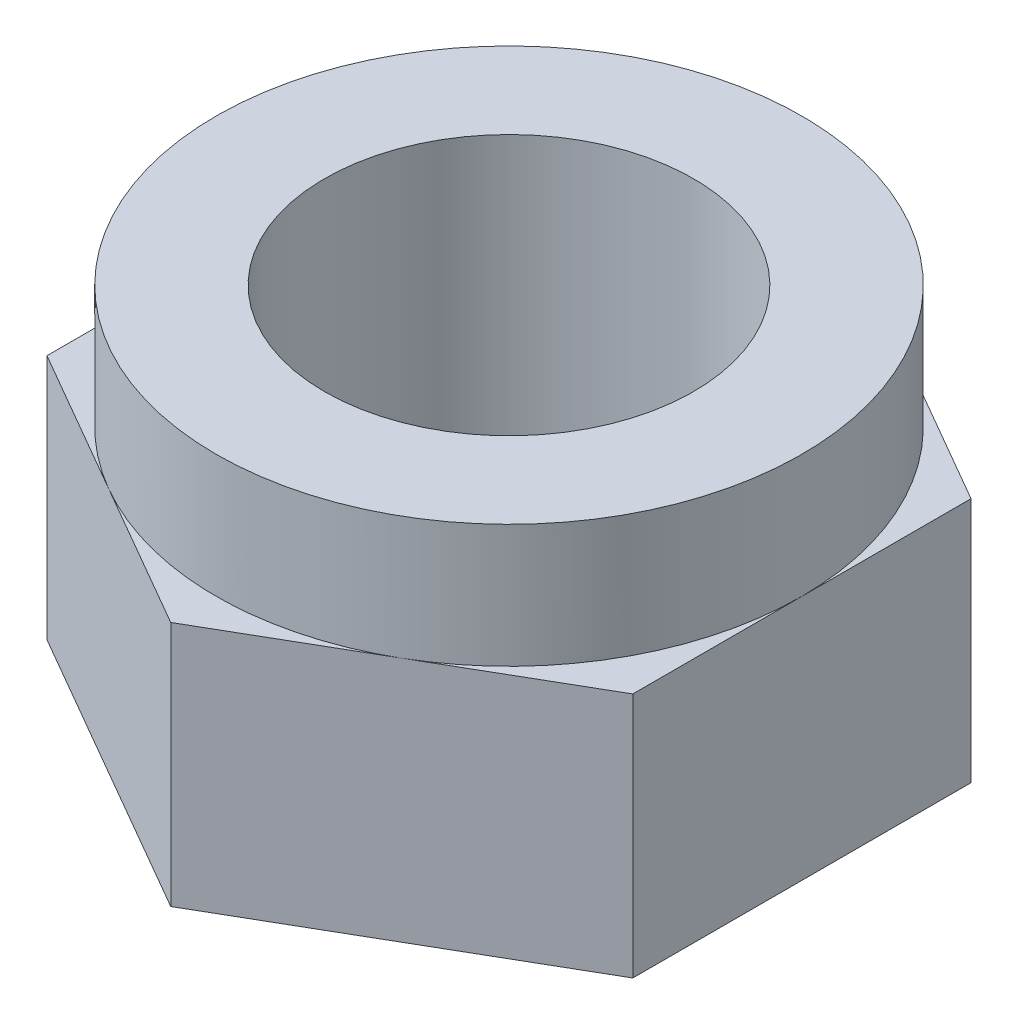
ISO-10303-21;
HEADER;
FILE_DESCRIPTION(('STEP AP214'),'2;1');
FILE_NAME('part.step','',(''),(''),'','','');
FILE_SCHEMA(('AUTOMOTIVE_DESIGN { 1 0 10303 214 1 1 1 1 }'));
ENDSEC;
DATA;
#1=APPLICATION_CONTEXT('core data for automotive mechanical design processes');
#2=APPLICATION_PROTOCOL_DEFINITION('international standard','automotive_design',2000,#1);
#3=PRODUCT_CONTEXT('',#1,'mechanical');
#4=PRODUCT('Part','Part','',(#3));
#5=PRODUCT_RELATED_PRODUCT_CATEGORY('part','',(#4));
#6=PRODUCT_DEFINITION_FORMATION('','',#4);
#7=PRODUCT_DEFINITION_CONTEXT('part definition',#1,'design');
#8=PRODUCT_DEFINITION('design','',#6,#7);
#9=PRODUCT_DEFINITION_SHAPE('','',#8);
#10=(LENGTH_UNIT() NAMED_UNIT(*) SI_UNIT(.MILLI.,.METRE.));
#11=(NAMED_UNIT(*) PLANE_ANGLE_UNIT() SI_UNIT($,.RADIAN.));
#12=(NAMED_UNIT(*) SI_UNIT($,.STERADIAN.) SOLID_ANGLE_UNIT());
#13=UNCERTAINTY_MEASURE_WITH_UNIT(LENGTH_MEASURE(1.E-05),#10,'distance_accuracy_value','');
#14=(GEOMETRIC_REPRESENTATION_CONTEXT(3) GLOBAL_UNCERTAINTY_ASSIGNED_CONTEXT((#13)) GLOBAL_UNIT_ASSIGNED_CONTEXT((#10,
#11,#12)) REPRESENTATION_CONTEXT('',''));
#15=CARTESIAN_POINT('',(0.,0.,0.));
#16=DIRECTION('',(0.,0.,1.));
#17=DIRECTION('',(1.,0.,0.));
#18=AXIS2_PLACEMENT_3D('',#15,#16,#17);
#19=CARTESIAN_POINT('',(0.,4.,0.));
#20=DIRECTION('',(0.,1.,0.));
#21=DIRECTION('',(0.,0.,1.));
#22=AXIS2_PLACEMENT_3D('',#19,#20,#21);
#23=PLANE('',#22);
#24=CARTESIAN_POINT('',(0.,4.,0.));
#25=DIRECTION('',(0.,1.,0.));
#26=DIRECTION('',(0.,0.,1.));
#27=AXIS2_PLACEMENT_3D('',#24,#25,#26);
#28=CIRCLE('',#27,4.76313972081441);
#29=CARTESIAN_POINT('',(2.38156986040721,4.,4.125));
#30=VERTEX_POINT('',#29);
#31=CARTESIAN_POINT('',(4.76313972081441,4.,0.));
#32=VERTEX_POINT('',#31);
#33=EDGE_CURVE('E47',#30,#32,#28,.T.);
#34=ORIENTED_EDGE('',*,*,#33,.F.);
#35=DIRECTION('',(0.866025403784439,0.,-0.5));
#36=VECTOR('',#35,1.);
#37=CARTESIAN_POINT('',(0.,4.,5.5));
#38=LINE('',#37,#36);
#39=CARTESIAN_POINT('',(4.76313972081441,4.,2.75));
#40=VERTEX_POINT('',#39);
#41=EDGE_CURVE('E115',#30,#40,#38,.T.);
#42=ORIENTED_EDGE('',*,*,#41,.T.);
#43=DIRECTION('',(0.,0.,-1.));
#44=VECTOR('',#43,1.);
#45=CARTESIAN_POINT('',(4.76313972081441,4.,2.75));
#46=LINE('',#45,#44);
#47=EDGE_CURVE('E127',#40,#32,#46,.T.);
#48=ORIENTED_EDGE('',*,*,#47,.T.);
#49=EDGE_LOOP('',(#34,#42,#48));
#50=FACE_BOUND('',#49,.T.);
#51=ADVANCED_FACE('F36',(#50),#23,.T.);
#52=CARTESIAN_POINT('',(2.38156986040721,4.,-4.125));
#53=VERTEX_POINT('',#52);
#54=EDGE_CURVE('E11',#32,#53,#28,.T.);
#55=ORIENTED_EDGE('',*,*,#54,.F.);
#56=CARTESIAN_POINT('',(4.76313972081441,4.,-2.75));
#57=VERTEX_POINT('',#56);
#58=EDGE_CURVE('E114',#32,#57,#46,.T.);
#59=ORIENTED_EDGE('',*,*,#58,.T.);
#60=DIRECTION('',(-0.866025403784439,0.,-0.5));
#61=VECTOR('',#60,1.);
#62=CARTESIAN_POINT('',(4.76313972081441,4.,-2.75));
#63=LINE('',#62,#61);
#64=EDGE_CURVE('E145',#57,#53,#63,.T.);
#65=ORIENTED_EDGE('',*,*,#64,.T.);
#66=EDGE_LOOP('',(#55,#59,#65));
#67=FACE_BOUND('',#66,.T.);
#68=ADVANCED_FACE('F206',(#67),#23,.T.);
#69=CARTESIAN_POINT('',(-2.38156986040721,4.,-4.125));
#70=VERTEX_POINT('',#69);
#71=EDGE_CURVE('E45',#53,#70,#28,.T.);
#72=ORIENTED_EDGE('',*,*,#71,.F.);
#73=CARTESIAN_POINT('',(0.,4.,-5.5));
#74=VERTEX_POINT('',#73);
#75=EDGE_CURVE('E148',#53,#74,#63,.T.);
#76=ORIENTED_EDGE('',*,*,#75,.T.);
#77=DIRECTION('',(-0.866025403784439,0.,0.5));
#78=VECTOR('',#77,1.);
#79=CARTESIAN_POINT('',(0.,4.,-5.5));
#80=LINE('',#79,#78);
#81=EDGE_CURVE('E149',#74,#70,#80,.T.);
#82=ORIENTED_EDGE('',*,*,#81,.T.);
#83=EDGE_LOOP('',(#72,#76,#82));
#84=FACE_BOUND('',#83,.T.);
#85=ADVANCED_FACE('F209',(#84),#23,.T.);
#86=CARTESIAN_POINT('',(-4.76313972081441,4.,0.));
#87=VERTEX_POINT('',#86);
#88=EDGE_CURVE('E135',#70,#87,#28,.T.);
#89=ORIENTED_EDGE('',*,*,#88,.F.);
#90=CARTESIAN_POINT('',(-4.76313972081441,4.,-2.75));
#91=VERTEX_POINT('',#90);
#92=EDGE_CURVE('E147',#70,#91,#80,.T.);
#93=ORIENTED_EDGE('',*,*,#92,.T.);
#94=DIRECTION('',(0.,0.,1.));
#95=VECTOR('',#94,1.);
#96=CARTESIAN_POINT('',(-4.76313972081441,4.,-2.75));
#97=LINE('',#96,#95);
#98=EDGE_CURVE('E153',#91,#87,#97,.T.);
#99=ORIENTED_EDGE('',*,*,#98,.T.);
#100=EDGE_LOOP('',(#89,#93,#99));
#101=FACE_BOUND('',#100,.T.);
#102=ADVANCED_FACE('F213',(#101),#23,.T.);
#103=CARTESIAN_POINT('',(-2.38156986040721,4.,4.125));
#104=VERTEX_POINT('',#103);
#105=EDGE_CURVE('E134',#87,#104,#28,.T.);
#106=ORIENTED_EDGE('',*,*,#105,.F.);
#107=CARTESIAN_POINT('',(-4.76313972081441,4.,2.75));
#108=VERTEX_POINT('',#107);
#109=EDGE_CURVE('E152',#87,#108,#97,.T.);
#110=ORIENTED_EDGE('',*,*,#109,.T.);
#111=DIRECTION('',(0.866025403784439,0.,0.5));
#112=VECTOR('',#111,1.);
#113=CARTESIAN_POINT('',(-4.76313972081441,4.,2.75));
#114=LINE('',#113,#112);
#115=EDGE_CURVE('E125',#108,#104,#114,.T.);
#116=ORIENTED_EDGE('',*,*,#115,.T.);
#117=EDGE_LOOP('',(#106,#110,#116));
#118=FACE_BOUND('',#117,.T.);
#119=ADVANCED_FACE('F215',(#118),#23,.T.);
#120=EDGE_CURVE('E60',#104,#30,#28,.T.);
#121=ORIENTED_EDGE('',*,*,#120,.F.);
#122=CARTESIAN_POINT('',(0.,4.,5.5));
#123=VERTEX_POINT('',#122);
#124=EDGE_CURVE('E110',#104,#123,#114,.T.);
#125=ORIENTED_EDGE('',*,*,#124,.T.);
#126=EDGE_CURVE('E107',#123,#30,#38,.T.);
#127=ORIENTED_EDGE('',*,*,#126,.T.);
#128=EDGE_LOOP('',(#121,#125,#127));
#129=FACE_BOUND('',#128,.T.);
#130=ADVANCED_FACE('F109',(#129),#23,.T.);
#131=CARTESIAN_POINT('',(0.,0.,0.));
#132=DIRECTION('',(0.,1.,0.));
#133=DIRECTION('',(0.,0.,1.));
#134=AXIS2_PLACEMENT_3D('',#131,#132,#133);
#135=PLANE('',#134);
#136=DIRECTION('',(-0.866025403784439,0.,-0.5));
#137=VECTOR('',#136,1.);
#138=CARTESIAN_POINT('',(4.76313972081441,0.,-2.75));
#139=LINE('',#138,#137);
#140=CARTESIAN_POINT('',(4.76313972081441,0.,-2.75));
#141=VERTEX_POINT('',#140);
#142=CARTESIAN_POINT('',(0.,0.,-5.5));
#143=VERTEX_POINT('',#142);
#144=EDGE_CURVE('E144',#141,#143,#139,.T.);
#145=ORIENTED_EDGE('',*,*,#144,.F.);
#146=DIRECTION('',(0.,0.,-1.));
#147=VECTOR('',#146,1.);
#148=CARTESIAN_POINT('',(4.76313972081441,0.,2.75));
#149=LINE('',#148,#147);
#150=CARTESIAN_POINT('',(4.76313972081441,0.,2.75));
#151=VERTEX_POINT('',#150);
#152=EDGE_CURVE('E170',#151,#141,#149,.T.);
#153=ORIENTED_EDGE('',*,*,#152,.F.);
#154=DIRECTION('',(0.866025403784439,0.,-0.5));
#155=VECTOR('',#154,1.);
#156=CARTESIAN_POINT('',(0.,0.,5.5));
#157=LINE('',#156,#155);
#158=CARTESIAN_POINT('',(0.,0.,5.5));
#159=VERTEX_POINT('',#158);
#160=EDGE_CURVE('E168',#159,#151,#157,.T.);
#161=ORIENTED_EDGE('',*,*,#160,.F.);
#162=DIRECTION('',(0.866025403784439,0.,0.5));
#163=VECTOR('',#162,1.);
#164=CARTESIAN_POINT('',(-4.76313972081441,0.,2.75));
#165=LINE('',#164,#163);
#166=CARTESIAN_POINT('',(-4.76313972081441,0.,2.75));
#167=VERTEX_POINT('',#166);
#168=EDGE_CURVE('E166',#167,#159,#165,.T.);
#169=ORIENTED_EDGE('',*,*,#168,.F.);
#170=DIRECTION('',(0.,0.,1.));
#171=VECTOR('',#170,1.);
#172=CARTESIAN_POINT('',(-4.76313972081441,0.,-2.75));
#173=LINE('',#172,#171);
#174=CARTESIAN_POINT('',(-4.76313972081441,0.,-2.75));
#175=VERTEX_POINT('',#174);
#176=EDGE_CURVE('E164',#175,#167,#173,.T.);
#177=ORIENTED_EDGE('',*,*,#176,.F.);
#178=DIRECTION('',(-0.866025403784439,0.,0.5));
#179=VECTOR('',#178,1.);
#180=CARTESIAN_POINT('',(0.,0.,-5.5));
#181=LINE('',#180,#179);
#182=EDGE_CURVE('E162',#143,#175,#181,.T.);
#183=ORIENTED_EDGE('',*,*,#182,.F.);
#184=EDGE_LOOP('',(#145,#153,#161,#169,#177,#183));
#185=FACE_BOUND('',#184,.T.);
#186=CARTESIAN_POINT('',(0.,0.,0.));
#187=DIRECTION('',(0.,1.,0.));
#188=DIRECTION('',(0.,0.,1.));
#189=AXIS2_PLACEMENT_3D('',#186,#187,#188);
#190=CIRCLE('',#189,3.);
#191=CARTESIAN_POINT('',(0.,0.,3.));
#192=VERTEX_POINT('',#191);
#193=EDGE_CURVE('E141',#192,#192,#190,.T.);
#194=ORIENTED_EDGE('',*,*,#193,.T.);
#195=EDGE_LOOP('',(#194));
#196=FACE_BOUND('',#195,.T.);
#197=ADVANCED_FACE('F192',(#185,#196),#135,.F.);
#198=CARTESIAN_POINT('',(4.76313972081441,4.,-2.75));
#199=DIRECTION('',(-0.5,0.,0.866025403784439));
#200=DIRECTION('',(0.866025403784439,0.,0.5));
#201=AXIS2_PLACEMENT_3D('',#198,#199,#200);
#202=PLANE('',#201);
#203=ORIENTED_EDGE('',*,*,#144,.T.);
#204=DIRECTION('',(0.,-1.,0.));
#205=VECTOR('',#204,1.);
#206=CARTESIAN_POINT('',(0.,4.,-5.5));
#207=LINE('',#206,#205);
#208=EDGE_CURVE('E40',#74,#143,#207,.T.);
#209=ORIENTED_EDGE('',*,*,#208,.F.);
#210=ORIENTED_EDGE('',*,*,#75,.F.);
#211=ORIENTED_EDGE('',*,*,#64,.F.);
#212=DIRECTION('',(0.,-1.,0.));
#213=VECTOR('',#212,1.);
#214=CARTESIAN_POINT('',(4.76313972081441,4.,-2.75));
#215=LINE('',#214,#213);
#216=EDGE_CURVE('E159',#57,#141,#215,.T.);
#217=ORIENTED_EDGE('',*,*,#216,.T.);
#218=EDGE_LOOP('',(#203,#209,#210,#211,#217));
#219=FACE_BOUND('',#218,.T.);
#220=ADVANCED_FACE('F38',(#219),#202,.F.);
#221=CARTESIAN_POINT('',(0.,4.,-5.5));
#222=DIRECTION('',(0.5,0.,0.866025403784439));
#223=DIRECTION('',(0.866025403784439,0.,-0.5));
#224=AXIS2_PLACEMENT_3D('',#221,#222,#223);
#225=PLANE('',#224);
#226=ORIENTED_EDGE('',*,*,#182,.T.);
#227=DIRECTION('',(0.,-1.,0.));
#228=VECTOR('',#227,1.);
#229=CARTESIAN_POINT('',(-4.76313972081441,4.,-2.75));
#230=LINE('',#229,#228);
#231=EDGE_CURVE('E137',#91,#175,#230,.T.);
#232=ORIENTED_EDGE('',*,*,#231,.F.);
#233=ORIENTED_EDGE('',*,*,#92,.F.);
#234=ORIENTED_EDGE('',*,*,#81,.F.);
#235=ORIENTED_EDGE('',*,*,#208,.T.);
#236=EDGE_LOOP('',(#226,#232,#233,#234,#235));
#237=FACE_BOUND('',#236,.T.);
#238=ADVANCED_FACE('F211',(#237),#225,.F.);
#239=CARTESIAN_POINT('',(-4.76313972081441,4.,-2.75));
#240=DIRECTION('',(1.,0.,0.));
#241=DIRECTION('',(0.,0.,-1.));
#242=AXIS2_PLACEMENT_3D('',#239,#240,#241);
#243=PLANE('',#242);
#244=ORIENTED_EDGE('',*,*,#176,.T.);
#245=DIRECTION('',(0.,-1.,0.));
#246=VECTOR('',#245,1.);
#247=CARTESIAN_POINT('',(-4.76313972081441,4.,2.75));
#248=LINE('',#247,#246);
#249=EDGE_CURVE('E177',#108,#167,#248,.T.);
#250=ORIENTED_EDGE('',*,*,#249,.F.);
#251=ORIENTED_EDGE('',*,*,#109,.F.);
#252=ORIENTED_EDGE('',*,*,#98,.F.);
#253=ORIENTED_EDGE('',*,*,#231,.T.);
#254=EDGE_LOOP('',(#244,#250,#251,#252,#253));
#255=FACE_BOUND('',#254,.T.);
#256=ADVANCED_FACE('F184',(#255),#243,.F.);
#257=CARTESIAN_POINT('',(-4.76313972081441,4.,2.75));
#258=DIRECTION('',(0.5,0.,-0.866025403784439));
#259=DIRECTION('',(-0.866025403784439,0.,-0.5));
#260=AXIS2_PLACEMENT_3D('',#257,#258,#259);
#261=PLANE('',#260);
#262=ORIENTED_EDGE('',*,*,#168,.T.);
#263=DIRECTION('',(0.,-1.,0.));
#264=VECTOR('',#263,1.);
#265=CARTESIAN_POINT('',(0.,4.,5.5));
#266=LINE('',#265,#264);
#267=EDGE_CURVE('E175',#123,#159,#266,.T.);
#268=ORIENTED_EDGE('',*,*,#267,.F.);
#269=ORIENTED_EDGE('',*,*,#124,.F.);
#270=ORIENTED_EDGE('',*,*,#115,.F.);
#271=ORIENTED_EDGE('',*,*,#249,.T.);
#272=EDGE_LOOP('',(#262,#268,#269,#270,#271));
#273=FACE_BOUND('',#272,.T.);
#274=ADVANCED_FACE('F197',(#273),#261,.F.);
#275=CARTESIAN_POINT('',(0.,4.,5.5));
#276=DIRECTION('',(-0.5,0.,-0.866025403784439));
#277=DIRECTION('',(-0.866025403784439,0.,0.5));
#278=AXIS2_PLACEMENT_3D('',#275,#276,#277);
#279=PLANE('',#278);
#280=ORIENTED_EDGE('',*,*,#160,.T.);
#281=DIRECTION('',(0.,-1.,0.));
#282=VECTOR('',#281,1.);
#283=CARTESIAN_POINT('',(4.76313972081441,4.,2.75));
#284=LINE('',#283,#282);
#285=EDGE_CURVE('E121',#40,#151,#284,.T.);
#286=ORIENTED_EDGE('',*,*,#285,.F.);
#287=ORIENTED_EDGE('',*,*,#41,.F.);
#288=ORIENTED_EDGE('',*,*,#126,.F.);
#289=ORIENTED_EDGE('',*,*,#267,.T.);
#290=EDGE_LOOP('',(#280,#286,#287,#288,#289));
#291=FACE_BOUND('',#290,.T.);
#292=ADVANCED_FACE('F119',(#291),#279,.F.);
#293=CARTESIAN_POINT('',(4.76313972081441,4.,2.75));
#294=DIRECTION('',(-1.,0.,0.));
#295=DIRECTION('',(0.,0.,1.));
#296=AXIS2_PLACEMENT_3D('',#293,#294,#295);
#297=PLANE('',#296);
#298=ORIENTED_EDGE('',*,*,#152,.T.);
#299=ORIENTED_EDGE('',*,*,#216,.F.);
#300=ORIENTED_EDGE('',*,*,#58,.F.);
#301=ORIENTED_EDGE('',*,*,#47,.F.);
#302=ORIENTED_EDGE('',*,*,#285,.T.);
#303=EDGE_LOOP('',(#298,#299,#300,#301,#302));
#304=FACE_BOUND('',#303,.T.);
#305=ADVANCED_FACE('F200',(#304),#297,.F.);
#306=CARTESIAN_POINT('',(0.,4.,0.));
#307=DIRECTION('',(0.,-1.,0.));
#308=DIRECTION('',(0.,0.,-1.));
#309=AXIS2_PLACEMENT_3D('',#306,#307,#308);
#310=CYLINDRICAL_SURFACE('',#309,3.);
#311=ORIENTED_EDGE('',*,*,#193,.F.);
#312=EDGE_LOOP('',(#311));
#313=FACE_BOUND('',#312,.T.);
#314=CARTESIAN_POINT('',(0.,6.,0.));
#315=DIRECTION('',(0.,1.,0.));
#316=DIRECTION('',(0.,0.,1.));
#317=AXIS2_PLACEMENT_3D('',#314,#315,#316);
#318=CIRCLE('',#317,3.);
#319=CARTESIAN_POINT('',(0.,6.,3.));
#320=VERTEX_POINT('',#319);
#321=EDGE_CURVE('E130',#320,#320,#318,.T.);
#322=ORIENTED_EDGE('',*,*,#321,.T.);
#323=EDGE_LOOP('',(#322));
#324=FACE_BOUND('',#323,.T.);
#325=ADVANCED_FACE('F238',(#313,#324),#310,.F.);
#326=CARTESIAN_POINT('',(0.,6.,0.));
#327=DIRECTION('',(0.,1.,0.));
#328=DIRECTION('',(0.,0.,1.));
#329=AXIS2_PLACEMENT_3D('',#326,#327,#328);
#330=PLANE('',#329);
#331=CARTESIAN_POINT('',(0.,6.,0.));
#332=DIRECTION('',(0.,1.,0.));
#333=DIRECTION('',(0.,0.,1.));
#334=AXIS2_PLACEMENT_3D('',#331,#332,#333);
#335=CIRCLE('',#334,4.76313972081441);
#336=CARTESIAN_POINT('',(0.,6.,4.76313972081441));
#337=VERTEX_POINT('',#336);
#338=EDGE_CURVE('E129',#337,#337,#335,.T.);
#339=ORIENTED_EDGE('',*,*,#338,.T.);
#340=EDGE_LOOP('',(#339));
#341=FACE_BOUND('',#340,.T.);
#342=ORIENTED_EDGE('',*,*,#321,.F.);
#343=EDGE_LOOP('',(#342));
#344=FACE_BOUND('',#343,.T.);
#345=ADVANCED_FACE('F271',(#341,#344),#330,.T.);
#346=CARTESIAN_POINT('',(0.,6.,0.));
#347=DIRECTION('',(0.,-1.,0.));
#348=DIRECTION('',(0.,0.,-1.));
#349=AXIS2_PLACEMENT_3D('',#346,#347,#348);
#350=CYLINDRICAL_SURFACE('',#349,4.76313972081441);
#351=ORIENTED_EDGE('',*,*,#338,.F.);
#352=EDGE_LOOP('',(#351));
#353=FACE_BOUND('',#352,.T.);
#354=ORIENTED_EDGE('',*,*,#33,.T.);
#355=ORIENTED_EDGE('',*,*,#54,.T.);
#356=ORIENTED_EDGE('',*,*,#71,.T.);
#357=ORIENTED_EDGE('',*,*,#88,.T.);
#358=ORIENTED_EDGE('',*,*,#105,.T.);
#359=ORIENTED_EDGE('',*,*,#120,.T.);
#360=EDGE_LOOP('',(#354,#355,#356,#357,#358,#359));
#361=FACE_BOUND('',#360,.T.);
#362=ADVANCED_FACE('F132',(#353,#361),#350,.T.);
#363=CLOSED_SHELL('',(#51,#68,#85,#102,#119,#130,#197,#220,#238,#256,#274,#292,#305,#325,#345,#362));
#364=MANIFOLD_SOLID_BREP('B2',#363);
#365=ADVANCED_BREP_SHAPE_REPRESENTATION('',(#18,#364),#14);
#366=SHAPE_DEFINITION_REPRESENTATION(#9,#365);
ENDSEC;
END-ISO-10303-21;
